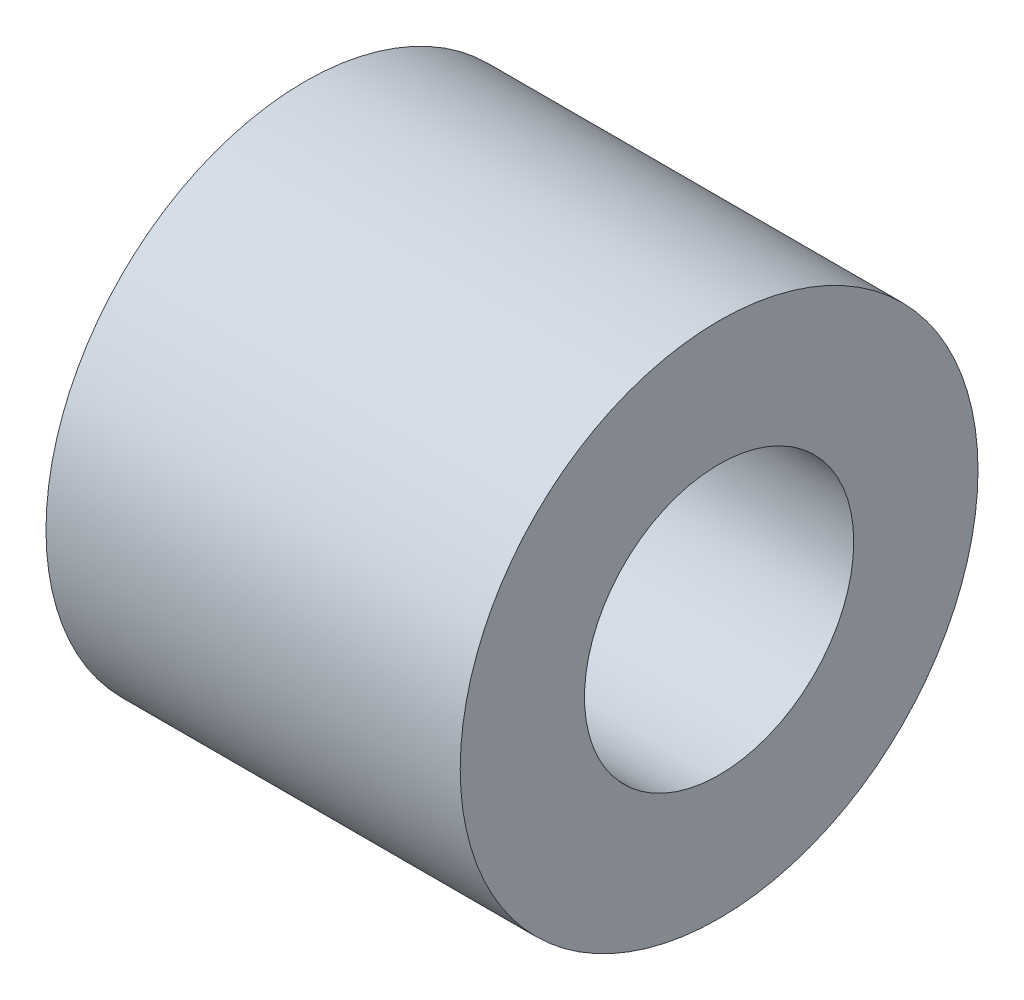
ISO-10303-21;
HEADER;
FILE_DESCRIPTION(('STEP AP214'),'2;1');
FILE_NAME('part.step','',(''),(''),'','','');
FILE_SCHEMA(('AUTOMOTIVE_DESIGN { 1 0 10303 214 1 1 1 1 }'));
ENDSEC;
DATA;
#1=APPLICATION_CONTEXT('core data for automotive mechanical design processes');
#2=APPLICATION_PROTOCOL_DEFINITION('international standard','automotive_design',2000,#1);
#3=PRODUCT_CONTEXT('',#1,'mechanical');
#4=PRODUCT('Part','Part','',(#3));
#5=PRODUCT_RELATED_PRODUCT_CATEGORY('part','',(#4));
#6=PRODUCT_DEFINITION_FORMATION('','',#4);
#7=PRODUCT_DEFINITION_CONTEXT('part definition',#1,'design');
#8=PRODUCT_DEFINITION('design','',#6,#7);
#9=PRODUCT_DEFINITION_SHAPE('','',#8);
#10=(LENGTH_UNIT() NAMED_UNIT(*) SI_UNIT(.MILLI.,.METRE.));
#11=(NAMED_UNIT(*) PLANE_ANGLE_UNIT() SI_UNIT($,.RADIAN.));
#12=(NAMED_UNIT(*) SI_UNIT($,.STERADIAN.) SOLID_ANGLE_UNIT());
#13=UNCERTAINTY_MEASURE_WITH_UNIT(LENGTH_MEASURE(1.E-05),#10,'distance_accuracy_value','');
#14=(GEOMETRIC_REPRESENTATION_CONTEXT(3) GLOBAL_UNCERTAINTY_ASSIGNED_CONTEXT((#13)) GLOBAL_UNIT_ASSIGNED_CONTEXT((#10,
#11,#12)) REPRESENTATION_CONTEXT('',''));
#15=CARTESIAN_POINT('',(0.,0.,0.));
#16=DIRECTION('',(0.,0.,1.));
#17=DIRECTION('',(1.,0.,0.));
#18=AXIS2_PLACEMENT_3D('',#15,#16,#17);
#19=CARTESIAN_POINT('',(10.16,0.,0.));
#20=DIRECTION('',(1.,0.,0.));
#21=DIRECTION('',(0.,0.,-1.));
#22=AXIS2_PLACEMENT_3D('',#19,#20,#21);
#23=PLANE('',#22);
#24=CARTESIAN_POINT('',(10.16,0.,0.));
#25=DIRECTION('',(1.,0.,0.));
#26=DIRECTION('',(0.,0.,-1.));
#27=AXIS2_PLACEMENT_3D('',#24,#25,#26);
#28=CIRCLE('',#27,6.35);
#29=CARTESIAN_POINT('',(10.16,0.,-6.35));
#30=VERTEX_POINT('',#29);
#31=EDGE_CURVE('E10',#30,#30,#28,.T.);
#32=ORIENTED_EDGE('',*,*,#31,.T.);
#33=EDGE_LOOP('',(#32));
#34=FACE_BOUND('',#33,.T.);
#35=CARTESIAN_POINT('',(10.16,0.,0.));
#36=DIRECTION('',(1.,0.,0.));
#37=DIRECTION('',(0.,0.,-1.));
#38=AXIS2_PLACEMENT_3D('',#35,#36,#37);
#39=CIRCLE('',#38,3.302);
#40=CARTESIAN_POINT('',(10.16,0.,-3.302));
#41=VERTEX_POINT('',#40);
#42=EDGE_CURVE('E42',#41,#41,#39,.T.);
#43=ORIENTED_EDGE('',*,*,#42,.F.);
#44=EDGE_LOOP('',(#43));
#45=FACE_BOUND('',#44,.T.);
#46=ADVANCED_FACE('F31',(#34,#45),#23,.T.);
#47=CARTESIAN_POINT('',(0.,0.,0.));
#48=DIRECTION('',(1.,0.,0.));
#49=DIRECTION('',(0.,0.,-1.));
#50=AXIS2_PLACEMENT_3D('',#47,#48,#49);
#51=PLANE('',#50);
#52=CARTESIAN_POINT('',(0.,0.,0.));
#53=DIRECTION('',(1.,0.,0.));
#54=DIRECTION('',(0.,0.,-1.));
#55=AXIS2_PLACEMENT_3D('',#52,#53,#54);
#56=CIRCLE('',#55,6.35);
#57=CARTESIAN_POINT('',(0.,0.,-6.35));
#58=VERTEX_POINT('',#57);
#59=EDGE_CURVE('E35',#58,#58,#56,.T.);
#60=ORIENTED_EDGE('',*,*,#59,.F.);
#61=EDGE_LOOP('',(#60));
#62=FACE_BOUND('',#61,.T.);
#63=CARTESIAN_POINT('',(0.,0.,0.));
#64=DIRECTION('',(1.,0.,0.));
#65=DIRECTION('',(0.,0.,-1.));
#66=AXIS2_PLACEMENT_3D('',#63,#64,#65);
#67=CIRCLE('',#66,3.302);
#68=CARTESIAN_POINT('',(0.,0.,-3.302));
#69=VERTEX_POINT('',#68);
#70=EDGE_CURVE('E44',#69,#69,#67,.T.);
#71=ORIENTED_EDGE('',*,*,#70,.T.);
#72=EDGE_LOOP('',(#71));
#73=FACE_BOUND('',#72,.T.);
#74=ADVANCED_FACE('F54',(#62,#73),#51,.F.);
#75=CARTESIAN_POINT('',(10.16,0.,0.));
#76=DIRECTION('',(-1.,0.,0.));
#77=DIRECTION('',(0.,0.,1.));
#78=AXIS2_PLACEMENT_3D('',#75,#76,#77);
#79=CYLINDRICAL_SURFACE('',#78,6.35);
#80=ORIENTED_EDGE('',*,*,#31,.F.);
#81=EDGE_LOOP('',(#80));
#82=FACE_BOUND('',#81,.T.);
#83=ORIENTED_EDGE('',*,*,#59,.T.);
#84=EDGE_LOOP('',(#83));
#85=FACE_BOUND('',#84,.T.);
#86=ADVANCED_FACE('F33',(#82,#85),#79,.T.);
#87=CARTESIAN_POINT('',(10.16,0.,0.));
#88=DIRECTION('',(-1.,0.,0.));
#89=DIRECTION('',(0.,0.,1.));
#90=AXIS2_PLACEMENT_3D('',#87,#88,#89);
#91=CYLINDRICAL_SURFACE('',#90,3.302);
#92=ORIENTED_EDGE('',*,*,#42,.T.);
#93=EDGE_LOOP('',(#92));
#94=FACE_BOUND('',#93,.T.);
#95=ORIENTED_EDGE('',*,*,#70,.F.);
#96=EDGE_LOOP('',(#95));
#97=FACE_BOUND('',#96,.T.);
#98=ADVANCED_FACE('F50',(#94,#97),#91,.F.);
#99=CLOSED_SHELL('',(#46,#74,#86,#98));
#100=MANIFOLD_SOLID_BREP('B2',#99);
#101=ADVANCED_BREP_SHAPE_REPRESENTATION('',(#18,#100),#14);
#102=SHAPE_DEFINITION_REPRESENTATION(#9,#101);
ENDSEC;
END-ISO-10303-21;
